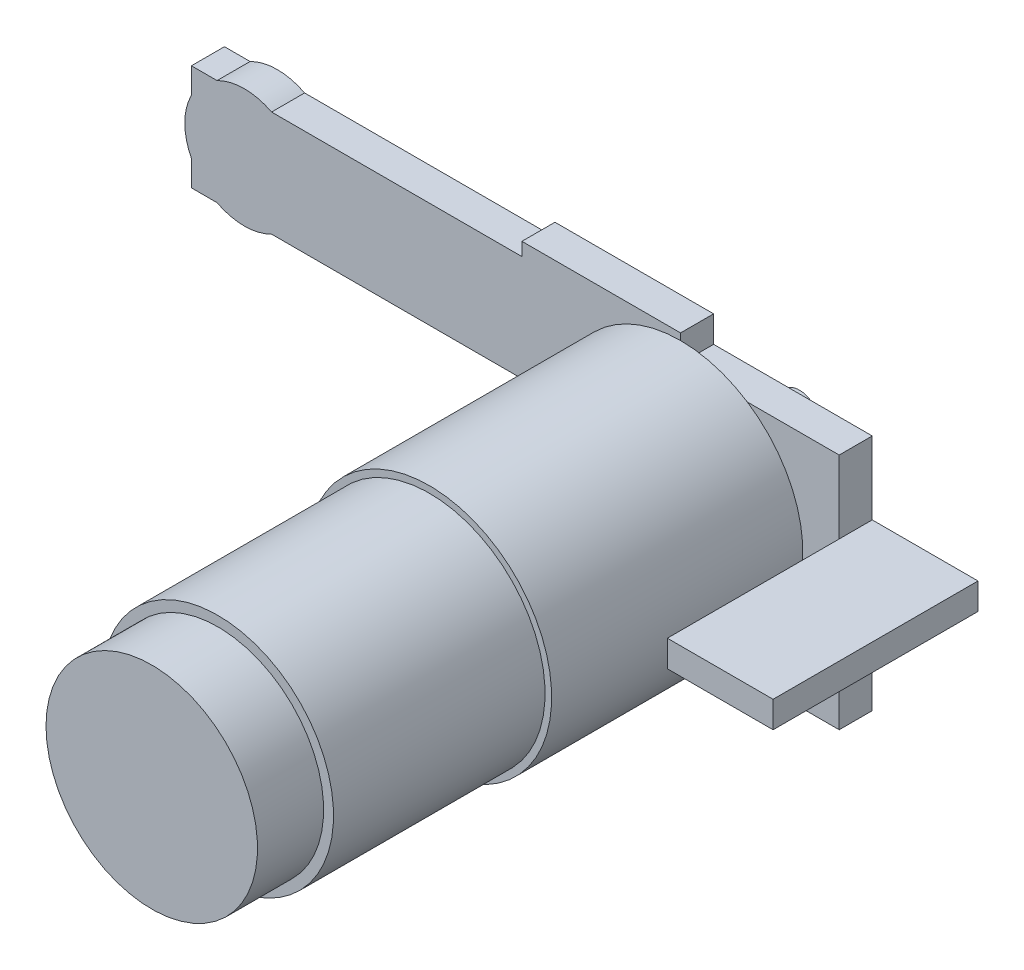
ISO-10303-21;
HEADER;
FILE_DESCRIPTION(('STEP AP214'),'2;1');
FILE_NAME('part.step','',(''),(''),'','','');
FILE_SCHEMA(('AUTOMOTIVE_DESIGN { 1 0 10303 214 1 1 1 1 }'));
ENDSEC;
DATA;
#1=APPLICATION_CONTEXT('core data for automotive mechanical design processes');
#2=APPLICATION_PROTOCOL_DEFINITION('international standard','automotive_design',2000,#1);
#3=PRODUCT_CONTEXT('',#1,'mechanical');
#4=PRODUCT('Part','Part','',(#3));
#5=PRODUCT_RELATED_PRODUCT_CATEGORY('part','',(#4));
#6=PRODUCT_DEFINITION_FORMATION('','',#4);
#7=PRODUCT_DEFINITION_CONTEXT('part definition',#1,'design');
#8=PRODUCT_DEFINITION('design','',#6,#7);
#9=PRODUCT_DEFINITION_SHAPE('','',#8);
#10=(LENGTH_UNIT() NAMED_UNIT(*) SI_UNIT(.MILLI.,.METRE.));
#11=(NAMED_UNIT(*) PLANE_ANGLE_UNIT() SI_UNIT($,.RADIAN.));
#12=(NAMED_UNIT(*) SI_UNIT($,.STERADIAN.) SOLID_ANGLE_UNIT());
#13=UNCERTAINTY_MEASURE_WITH_UNIT(LENGTH_MEASURE(1.E-05),#10,'distance_accuracy_value','');
#14=(GEOMETRIC_REPRESENTATION_CONTEXT(3) GLOBAL_UNCERTAINTY_ASSIGNED_CONTEXT((#13)) GLOBAL_UNIT_ASSIGNED_CONTEXT((#10,
#11,#12)) REPRESENTATION_CONTEXT('',''));
#15=CARTESIAN_POINT('',(0.,0.,0.));
#16=DIRECTION('',(0.,0.,1.));
#17=DIRECTION('',(1.,0.,0.));
#18=AXIS2_PLACEMENT_3D('',#15,#16,#17);
#19=CARTESIAN_POINT('',(41.5,36.,-31.));
#20=DIRECTION('',(-1.,0.,0.));
#21=DIRECTION('',(0.,0.,1.));
#22=AXIS2_PLACEMENT_3D('',#19,#20,#21);
#23=PLANE('',#22);
#24=DIRECTION('',(0.,0.,1.));
#25=VECTOR('',#24,1.);
#26=CARTESIAN_POINT('',(41.5,25.,-36.));
#27=LINE('',#26,#25);
#28=CARTESIAN_POINT('',(41.5,25.,-36.));
#29=VERTEX_POINT('',#28);
#30=CARTESIAN_POINT('',(41.5,25.,-31.));
#31=VERTEX_POINT('',#30);
#32=EDGE_CURVE('E197',#29,#31,#27,.T.);
#33=ORIENTED_EDGE('',*,*,#32,.F.);
#34=DIRECTION('',(0.,-1.,0.));
#35=VECTOR('',#34,1.);
#36=CARTESIAN_POINT('',(41.5,36.,-36.));
#37=LINE('',#36,#35);
#38=CARTESIAN_POINT('',(41.5,36.,-36.));
#39=VERTEX_POINT('',#38);
#40=EDGE_CURVE('E292',#39,#29,#37,.T.);
#41=ORIENTED_EDGE('',*,*,#40,.F.);
#42=DIRECTION('',(0.,0.,-1.));
#43=VECTOR('',#42,1.);
#44=CARTESIAN_POINT('',(41.5,36.,-31.));
#45=LINE('',#44,#43);
#46=CARTESIAN_POINT('',(41.5,36.,-31.));
#47=VERTEX_POINT('',#46);
#48=EDGE_CURVE('E284',#47,#39,#45,.T.);
#49=ORIENTED_EDGE('',*,*,#48,.F.);
#50=DIRECTION('',(0.,-1.,0.));
#51=VECTOR('',#50,1.);
#52=CARTESIAN_POINT('',(41.5,36.,-31.));
#53=LINE('',#52,#51);
#54=EDGE_CURVE('E293',#47,#31,#53,.T.);
#55=ORIENTED_EDGE('',*,*,#54,.T.);
#56=EDGE_LOOP('',(#33,#41,#49,#55));
#57=FACE_BOUND('',#56,.T.);
#58=ADVANCED_FACE('F43',(#57),#23,.F.);
#59=CARTESIAN_POINT('',(-56.5,38.,-36.));
#60=DIRECTION('',(1.,0.,0.));
#61=DIRECTION('',(0.,0.,-1.));
#62=AXIS2_PLACEMENT_3D('',#59,#60,#61);
#63=PLANE('',#62);
#64=DIRECTION('',(0.,0.,-1.));
#65=VECTOR('',#64,1.);
#66=CARTESIAN_POINT('',(-56.5,25.8768943743823,-31.));
#67=LINE('',#66,#65);
#68=CARTESIAN_POINT('',(-56.5,25.8768943743823,-36.));
#69=VERTEX_POINT('',#68);
#70=CARTESIAN_POINT('',(-56.5,25.8768943743823,-31.));
#71=VERTEX_POINT('',#70);
#72=EDGE_CURVE('E238',#69,#71,#67,.F.);
#73=ORIENTED_EDGE('',*,*,#72,.F.);
#74=DIRECTION('',(0.,-1.,0.));
#75=VECTOR('',#74,1.);
#76=CARTESIAN_POINT('',(-56.5,38.,-36.));
#77=LINE('',#76,#75);
#78=CARTESIAN_POINT('',(-56.5,22.,-36.));
#79=VERTEX_POINT('',#78);
#80=EDGE_CURVE('E259',#69,#79,#77,.T.);
#81=ORIENTED_EDGE('',*,*,#80,.T.);
#82=DIRECTION('',(0.,0.,1.));
#83=VECTOR('',#82,1.);
#84=CARTESIAN_POINT('',(-56.5,22.,-36.));
#85=LINE('',#84,#83);
#86=CARTESIAN_POINT('',(-56.5,22.,-31.));
#87=VERTEX_POINT('',#86);
#88=EDGE_CURVE('E242',#79,#87,#85,.T.);
#89=ORIENTED_EDGE('',*,*,#88,.T.);
#90=DIRECTION('',(0.,-1.,0.));
#91=VECTOR('',#90,1.);
#92=CARTESIAN_POINT('',(-56.5,38.,-31.));
#93=LINE('',#92,#91);
#94=EDGE_CURVE('E272',#71,#87,#93,.T.);
#95=ORIENTED_EDGE('',*,*,#94,.F.);
#96=EDGE_LOOP('',(#73,#81,#89,#95));
#97=FACE_BOUND('',#96,.T.);
#98=ADVANCED_FACE('F384',(#97),#63,.F.);
#99=DIRECTION('',(0.,0.,-1.));
#100=VECTOR('',#99,1.);
#101=CARTESIAN_POINT('',(-56.5,34.1231056256177,-31.));
#102=LINE('',#101,#100);
#103=CARTESIAN_POINT('',(-56.5,34.1231056256177,-31.));
#104=VERTEX_POINT('',#103);
#105=CARTESIAN_POINT('',(-56.5,34.1231056256177,-36.));
#106=VERTEX_POINT('',#105);
#107=EDGE_CURVE('E240',#104,#106,#102,.T.);
#108=ORIENTED_EDGE('',*,*,#107,.F.);
#109=CARTESIAN_POINT('',(-56.5,38.,-31.));
#110=VERTEX_POINT('',#109);
#111=EDGE_CURVE('E273',#110,#104,#93,.T.);
#112=ORIENTED_EDGE('',*,*,#111,.F.);
#113=DIRECTION('',(0.,0.,1.));
#114=VECTOR('',#113,1.);
#115=CARTESIAN_POINT('',(-56.5,38.,-36.));
#116=LINE('',#115,#114);
#117=CARTESIAN_POINT('',(-56.5,38.,-36.));
#118=VERTEX_POINT('',#117);
#119=EDGE_CURVE('E243',#118,#110,#116,.T.);
#120=ORIENTED_EDGE('',*,*,#119,.F.);
#121=EDGE_CURVE('E271',#118,#106,#77,.T.);
#122=ORIENTED_EDGE('',*,*,#121,.T.);
#123=EDGE_LOOP('',(#108,#112,#120,#122));
#124=FACE_BOUND('',#123,.T.);
#125=ADVANCED_FACE('F391',(#124),#63,.F.);
#126=CARTESIAN_POINT('',(0.,38.,0.));
#127=DIRECTION('',(0.,1.,0.));
#128=DIRECTION('',(0.,0.,1.));
#129=AXIS2_PLACEMENT_3D('',#126,#127,#128);
#130=PLANE('',#129);
#131=DIRECTION('',(-1.,0.,0.));
#132=VECTOR('',#131,1.);
#133=CARTESIAN_POINT('',(-6.5,38.,-36.));
#134=LINE('',#133,#132);
#135=CARTESIAN_POINT('',(-6.5,38.,-36.));
#136=VERTEX_POINT('',#135);
#137=CARTESIAN_POINT('',(-44.3768943743823,38.,-36.));
#138=VERTEX_POINT('',#137);
#139=EDGE_CURVE('E258',#136,#138,#134,.T.);
#140=ORIENTED_EDGE('',*,*,#139,.T.);
#141=DIRECTION('',(0.,0.,-1.));
#142=VECTOR('',#141,1.);
#143=CARTESIAN_POINT('',(-44.3768943743823,38.,-31.));
#144=LINE('',#143,#142);
#145=CARTESIAN_POINT('',(-44.3768943743823,38.,-31.));
#146=VERTEX_POINT('',#145);
#147=EDGE_CURVE('E231',#138,#146,#144,.F.);
#148=ORIENTED_EDGE('',*,*,#147,.T.);
#149=DIRECTION('',(1.,0.,0.));
#150=VECTOR('',#149,1.);
#151=CARTESIAN_POINT('',(-56.5,38.,-31.));
#152=LINE('',#151,#150);
#153=CARTESIAN_POINT('',(-6.5,38.,-31.));
#154=VERTEX_POINT('',#153);
#155=EDGE_CURVE('E249',#146,#154,#152,.T.);
#156=ORIENTED_EDGE('',*,*,#155,.T.);
#157=DIRECTION('',(0.,0.,-1.));
#158=VECTOR('',#157,1.);
#159=CARTESIAN_POINT('',(-6.5,38.,-31.));
#160=LINE('',#159,#158);
#161=EDGE_CURVE('E252',#154,#136,#160,.T.);
#162=ORIENTED_EDGE('',*,*,#161,.T.);
#163=EDGE_LOOP('',(#140,#148,#156,#162));
#164=FACE_BOUND('',#163,.T.);
#165=ADVANCED_FACE('F396',(#164),#130,.T.);
#166=CARTESIAN_POINT('',(-52.6231056256177,38.,-31.));
#167=VERTEX_POINT('',#166);
#168=EDGE_CURVE('E246',#110,#167,#152,.T.);
#169=ORIENTED_EDGE('',*,*,#168,.T.);
#170=DIRECTION('',(0.,0.,-1.));
#171=VECTOR('',#170,1.);
#172=CARTESIAN_POINT('',(-52.6231056256177,38.,-31.));
#173=LINE('',#172,#171);
#174=CARTESIAN_POINT('',(-52.6231056256177,38.,-36.));
#175=VERTEX_POINT('',#174);
#176=EDGE_CURVE('E227',#167,#175,#173,.T.);
#177=ORIENTED_EDGE('',*,*,#176,.T.);
#178=EDGE_CURVE('E254',#175,#118,#134,.T.);
#179=ORIENTED_EDGE('',*,*,#178,.T.);
#180=ORIENTED_EDGE('',*,*,#119,.T.);
#181=EDGE_LOOP('',(#169,#177,#179,#180));
#182=FACE_BOUND('',#181,.T.);
#183=ADVANCED_FACE('F392',(#182),#130,.T.);
#184=CARTESIAN_POINT('',(0.,22.,0.));
#185=DIRECTION('',(0.,1.,0.));
#186=DIRECTION('',(0.,0.,1.));
#187=AXIS2_PLACEMENT_3D('',#184,#185,#186);
#188=PLANE('',#187);
#189=DIRECTION('',(0.,0.,-1.));
#190=VECTOR('',#189,1.);
#191=CARTESIAN_POINT('',(-44.3768943743823,22.,-31.));
#192=LINE('',#191,#190);
#193=CARTESIAN_POINT('',(-44.3768943743823,22.,-36.));
#194=VERTEX_POINT('',#193);
#195=CARTESIAN_POINT('',(-44.3768943743823,22.,-31.));
#196=VERTEX_POINT('',#195);
#197=EDGE_CURVE('E11',#194,#196,#192,.F.);
#198=ORIENTED_EDGE('',*,*,#197,.F.);
#199=DIRECTION('',(-1.,0.,0.));
#200=VECTOR('',#199,1.);
#201=CARTESIAN_POINT('',(-6.5,22.,-36.));
#202=LINE('',#201,#200);
#203=CARTESIAN_POINT('',(-6.5,22.,-36.));
#204=VERTEX_POINT('',#203);
#205=EDGE_CURVE('E250',#204,#194,#202,.T.);
#206=ORIENTED_EDGE('',*,*,#205,.F.);
#207=DIRECTION('',(0.,0.,-1.));
#208=VECTOR('',#207,1.);
#209=CARTESIAN_POINT('',(-6.5,22.,-31.));
#210=LINE('',#209,#208);
#211=CARTESIAN_POINT('',(-6.5,22.,-31.));
#212=VERTEX_POINT('',#211);
#213=EDGE_CURVE('E266',#212,#204,#210,.T.);
#214=ORIENTED_EDGE('',*,*,#213,.F.);
#215=DIRECTION('',(1.,0.,0.));
#216=VECTOR('',#215,1.);
#217=CARTESIAN_POINT('',(-56.5,22.,-31.));
#218=LINE('',#217,#216);
#219=EDGE_CURVE('E265',#196,#212,#218,.T.);
#220=ORIENTED_EDGE('',*,*,#219,.F.);
#221=EDGE_LOOP('',(#198,#206,#214,#220));
#222=FACE_BOUND('',#221,.T.);
#223=ADVANCED_FACE('F375',(#222),#188,.F.);
#224=DIRECTION('',(0.,0.,-1.));
#225=VECTOR('',#224,1.);
#226=CARTESIAN_POINT('',(-52.6231056256177,22.,-31.));
#227=LINE('',#226,#225);
#228=CARTESIAN_POINT('',(-52.6231056256177,22.,-31.));
#229=VERTEX_POINT('',#228);
#230=CARTESIAN_POINT('',(-52.6231056256177,22.,-36.));
#231=VERTEX_POINT('',#230);
#232=EDGE_CURVE('E51',#229,#231,#227,.T.);
#233=ORIENTED_EDGE('',*,*,#232,.F.);
#234=EDGE_CURVE('E263',#87,#229,#218,.T.);
#235=ORIENTED_EDGE('',*,*,#234,.F.);
#236=ORIENTED_EDGE('',*,*,#88,.F.);
#237=EDGE_CURVE('E268',#231,#79,#202,.T.);
#238=ORIENTED_EDGE('',*,*,#237,.F.);
#239=EDGE_LOOP('',(#233,#235,#236,#238));
#240=FACE_BOUND('',#239,.T.);
#241=ADVANCED_FACE('F723',(#240),#188,.F.);
#242=CARTESIAN_POINT('',(-6.5,40.,-36.));
#243=DIRECTION('',(1.,0.,0.));
#244=DIRECTION('',(0.,0.,-1.));
#245=AXIS2_PLACEMENT_3D('',#242,#243,#244);
#246=PLANE('',#245);
#247=ORIENTED_EDGE('',*,*,#161,.F.);
#248=DIRECTION('',(0.,-1.,0.));
#249=VECTOR('',#248,1.);
#250=CARTESIAN_POINT('',(-6.5,40.,-31.));
#251=LINE('',#250,#249);
#252=CARTESIAN_POINT('',(-6.5,40.,-31.));
#253=VERTEX_POINT('',#252);
#254=EDGE_CURVE('E330',#253,#154,#251,.T.);
#255=ORIENTED_EDGE('',*,*,#254,.F.);
#256=DIRECTION('',(0.,0.,1.));
#257=VECTOR('',#256,1.);
#258=CARTESIAN_POINT('',(-6.5,40.,-36.));
#259=LINE('',#258,#257);
#260=CARTESIAN_POINT('',(-6.5,40.,-36.));
#261=VERTEX_POINT('',#260);
#262=EDGE_CURVE('E298',#261,#253,#259,.T.);
#263=ORIENTED_EDGE('',*,*,#262,.F.);
#264=DIRECTION('',(0.,-1.,0.));
#265=VECTOR('',#264,1.);
#266=CARTESIAN_POINT('',(-6.5,40.,-36.));
#267=LINE('',#266,#265);
#268=EDGE_CURVE('E320',#261,#136,#267,.T.);
#269=ORIENTED_EDGE('',*,*,#268,.T.);
#270=EDGE_LOOP('',(#247,#255,#263,#269));
#271=FACE_BOUND('',#270,.T.);
#272=ADVANCED_FACE('F405',(#271),#246,.F.);
#273=CARTESIAN_POINT('',(17.5,40.,-31.));
#274=DIRECTION('',(-1.,0.,0.));
#275=DIRECTION('',(0.,0.,1.));
#276=AXIS2_PLACEMENT_3D('',#273,#274,#275);
#277=PLANE('',#276);
#278=DIRECTION('',(0.,0.,1.));
#279=VECTOR('',#278,1.);
#280=CARTESIAN_POINT('',(17.5,36.,-36.));
#281=LINE('',#280,#279);
#282=CARTESIAN_POINT('',(17.5,36.,-36.));
#283=VERTEX_POINT('',#282);
#284=CARTESIAN_POINT('',(17.5,36.,-31.));
#285=VERTEX_POINT('',#284);
#286=EDGE_CURVE('E279',#283,#285,#281,.T.);
#287=ORIENTED_EDGE('',*,*,#286,.F.);
#288=DIRECTION('',(0.,-1.,0.));
#289=VECTOR('',#288,1.);
#290=CARTESIAN_POINT('',(17.5,40.,-36.));
#291=LINE('',#290,#289);
#292=CARTESIAN_POINT('',(17.5,40.,-36.));
#293=VERTEX_POINT('',#292);
#294=EDGE_CURVE('E317',#293,#283,#291,.T.);
#295=ORIENTED_EDGE('',*,*,#294,.F.);
#296=DIRECTION('',(0.,0.,-1.));
#297=VECTOR('',#296,1.);
#298=CARTESIAN_POINT('',(17.5,40.,-31.));
#299=LINE('',#298,#297);
#300=CARTESIAN_POINT('',(17.5,40.,-31.));
#301=VERTEX_POINT('',#300);
#302=EDGE_CURVE('E303',#301,#293,#299,.T.);
#303=ORIENTED_EDGE('',*,*,#302,.F.);
#304=DIRECTION('',(0.,-1.,0.));
#305=VECTOR('',#304,1.);
#306=CARTESIAN_POINT('',(17.5,40.,-31.));
#307=LINE('',#306,#305);
#308=CARTESIAN_POINT('',(17.5,39.,-31.));
#309=VERTEX_POINT('',#308);
#310=EDGE_CURVE('E323',#301,#309,#307,.T.);
#311=ORIENTED_EDGE('',*,*,#310,.T.);
#312=EDGE_CURVE('E325',#309,#285,#307,.T.);
#313=ORIENTED_EDGE('',*,*,#312,.T.);
#314=EDGE_LOOP('',(#287,#295,#303,#311,#313));
#315=FACE_BOUND('',#314,.T.);
#316=ADVANCED_FACE('F415',(#315),#277,.F.);
#317=CARTESIAN_POINT('',(17.5,20.5,-54.));
#318=DIRECTION('',(0.,0.,-1.));
#319=DIRECTION('',(-1.,0.,0.));
#320=AXIS2_PLACEMENT_3D('',#317,#318,#319);
#321=CYLINDRICAL_SURFACE('',#320,3.);
#322=CARTESIAN_POINT('',(17.5,20.5,-49.));
#323=DIRECTION('',(0.,0.,-1.));
#324=DIRECTION('',(-1.,0.,0.));
#325=AXIS2_PLACEMENT_3D('',#322,#323,#324);
#326=CIRCLE('',#325,3.);
#327=CARTESIAN_POINT('',(14.5,20.5,-49.));
#328=VERTEX_POINT('',#327);
#329=EDGE_CURVE('E349',#328,#328,#326,.T.);
#330=ORIENTED_EDGE('',*,*,#329,.F.);
#331=EDGE_LOOP('',(#330));
#332=FACE_BOUND('',#331,.T.);
#333=CARTESIAN_POINT('',(17.5,20.5,-36.));
#334=DIRECTION('',(0.,0.,1.));
#335=DIRECTION('',(1.,0.,0.));
#336=AXIS2_PLACEMENT_3D('',#333,#334,#335);
#337=CIRCLE('',#336,3.);
#338=CARTESIAN_POINT('',(20.5,20.5,-36.));
#339=VERTEX_POINT('',#338);
#340=EDGE_CURVE('E355',#339,#339,#337,.T.);
#341=ORIENTED_EDGE('',*,*,#340,.F.);
#342=EDGE_LOOP('',(#341));
#343=FACE_BOUND('',#342,.T.);
#344=ADVANCED_FACE('F475',(#332,#343),#321,.T.);
#345=CARTESIAN_POINT('',(20.5,20.5,-31.));
#346=DIRECTION('',(0.,0.,1.));
#347=DIRECTION('',(1.,0.,0.));
#348=AXIS2_PLACEMENT_3D('',#345,#346,#347);
#349=PLANE('',#348);
#350=DIRECTION('',(1.,0.,0.));
#351=VECTOR('',#350,1.);
#352=CARTESIAN_POINT('',(17.5,36.,-31.));
#353=LINE('',#352,#351);
#354=CARTESIAN_POINT('',(27.5995049383621,36.,-31.));
#355=VERTEX_POINT('',#354);
#356=EDGE_CURVE('E285',#285,#355,#353,.T.);
#357=ORIENTED_EDGE('',*,*,#356,.F.);
#358=ORIENTED_EDGE('',*,*,#312,.F.);
#359=CARTESIAN_POINT('',(17.5,20.5,-31.));
#360=DIRECTION('',(0.,0.,-1.));
#361=DIRECTION('',(-1.,0.,0.));
#362=AXIS2_PLACEMENT_3D('',#359,#360,#361);
#363=CIRCLE('',#362,18.5);
#364=EDGE_CURVE('E347',#309,#355,#363,.T.);
#365=ORIENTED_EDGE('',*,*,#364,.T.);
#366=EDGE_LOOP('',(#357,#358,#365));
#367=FACE_BOUND('',#366,.T.);
#368=ADVANCED_FACE('F504',(#367),#349,.F.);
#369=CARTESIAN_POINT('',(17.5,20.5,-49.));
#370=DIRECTION('',(0.,0.,1.));
#371=DIRECTION('',(1.,0.,0.));
#372=AXIS2_PLACEMENT_3D('',#369,#370,#371);
#373=PLANE('',#372);
#374=ORIENTED_EDGE('',*,*,#329,.T.);
#375=EDGE_LOOP('',(#374));
#376=FACE_BOUND('',#375,.T.);
#377=ADVANCED_FACE('F44',(#376),#373,.F.);
#378=CARTESIAN_POINT('',(17.5,20.5,-54.));
#379=DIRECTION('',(0.,0.,-1.));
#380=DIRECTION('',(-1.,0.,0.));
#381=AXIS2_PLACEMENT_3D('',#378,#379,#380);
#382=CYLINDRICAL_SURFACE('',#381,18.5);
#383=ORIENTED_EDGE('',*,*,#364,.F.);
#384=EDGE_CURVE('E343',#355,#309,#363,.T.);
#385=ORIENTED_EDGE('',*,*,#384,.F.);
#386=EDGE_LOOP('',(#383,#385));
#387=FACE_BOUND('',#386,.T.);
#388=CARTESIAN_POINT('',(17.5,20.5,7.));
#389=DIRECTION('',(0.,0.,-1.));
#390=DIRECTION('',(-1.,0.,0.));
#391=AXIS2_PLACEMENT_3D('',#388,#389,#390);
#392=CIRCLE('',#391,18.5);
#393=CARTESIAN_POINT('',(-0.999999999999994,20.5,7.));
#394=VERTEX_POINT('',#393);
#395=EDGE_CURVE('E344',#394,#394,#392,.T.);
#396=ORIENTED_EDGE('',*,*,#395,.T.);
#397=EDGE_LOOP('',(#396));
#398=FACE_BOUND('',#397,.T.);
#399=ADVANCED_FACE('F498',(#387,#398),#382,.T.);
#400=CARTESIAN_POINT('',(36.,20.5,7.));
#401=DIRECTION('',(0.,0.,-1.));
#402=DIRECTION('',(-1.,0.,0.));
#403=AXIS2_PLACEMENT_3D('',#400,#401,#402);
#404=PLANE('',#403);
#405=ORIENTED_EDGE('',*,*,#395,.F.);
#406=EDGE_LOOP('',(#405));
#407=FACE_BOUND('',#406,.T.);
#408=CARTESIAN_POINT('',(17.5,20.5,7.));
#409=DIRECTION('',(0.,0.,-1.));
#410=DIRECTION('',(-1.,0.,0.));
#411=AXIS2_PLACEMENT_3D('',#408,#409,#410);
#412=CIRCLE('',#411,17.5);
#413=CARTESIAN_POINT('',(0.,20.5,7.));
#414=VERTEX_POINT('',#413);
#415=EDGE_CURVE('E338',#414,#414,#412,.T.);
#416=ORIENTED_EDGE('',*,*,#415,.T.);
#417=EDGE_LOOP('',(#416));
#418=FACE_BOUND('',#417,.T.);
#419=ADVANCED_FACE('F497',(#407,#418),#404,.F.);
#420=CARTESIAN_POINT('',(17.5,20.5,-54.));
#421=DIRECTION('',(0.,0.,-1.));
#422=DIRECTION('',(-1.,0.,0.));
#423=AXIS2_PLACEMENT_3D('',#420,#421,#422);
#424=CYLINDRICAL_SURFACE('',#423,17.5);
#425=ORIENTED_EDGE('',*,*,#415,.F.);
#426=EDGE_LOOP('',(#425));
#427=FACE_BOUND('',#426,.T.);
#428=CARTESIAN_POINT('',(17.5,20.5,39.));
#429=DIRECTION('',(0.,0.,-1.));
#430=DIRECTION('',(-1.,0.,0.));
#431=AXIS2_PLACEMENT_3D('',#428,#429,#430);
#432=CIRCLE('',#431,17.5);
#433=CARTESIAN_POINT('',(0.,20.5,39.));
#434=VERTEX_POINT('',#433);
#435=EDGE_CURVE('E336',#434,#434,#432,.T.);
#436=ORIENTED_EDGE('',*,*,#435,.T.);
#437=EDGE_LOOP('',(#436));
#438=FACE_BOUND('',#437,.T.);
#439=ADVANCED_FACE('F495',(#427,#438),#424,.T.);
#440=CARTESIAN_POINT('',(35.,20.5,39.));
#441=DIRECTION('',(0.,0.,-1.));
#442=DIRECTION('',(-1.,0.,0.));
#443=AXIS2_PLACEMENT_3D('',#440,#441,#442);
#444=PLANE('',#443);
#445=ORIENTED_EDGE('',*,*,#435,.F.);
#446=EDGE_LOOP('',(#445));
#447=FACE_BOUND('',#446,.T.);
#448=CARTESIAN_POINT('',(17.5,20.5,39.));
#449=DIRECTION('',(0.,0.,-1.));
#450=DIRECTION('',(-1.,0.,0.));
#451=AXIS2_PLACEMENT_3D('',#448,#449,#450);
#452=CIRCLE('',#451,16.);
#453=CARTESIAN_POINT('',(1.5,20.5,39.));
#454=VERTEX_POINT('',#453);
#455=EDGE_CURVE('E334',#454,#454,#452,.T.);
#456=ORIENTED_EDGE('',*,*,#455,.T.);
#457=EDGE_LOOP('',(#456));
#458=FACE_BOUND('',#457,.T.);
#459=ADVANCED_FACE('F488',(#447,#458),#444,.F.);
#460=CARTESIAN_POINT('',(17.5,20.5,-54.));
#461=DIRECTION('',(0.,0.,-1.));
#462=DIRECTION('',(-1.,0.,0.));
#463=AXIS2_PLACEMENT_3D('',#460,#461,#462);
#464=CYLINDRICAL_SURFACE('',#463,16.);
#465=ORIENTED_EDGE('',*,*,#455,.F.);
#466=EDGE_LOOP('',(#465));
#467=FACE_BOUND('',#466,.T.);
#468=CARTESIAN_POINT('',(17.5,20.5,49.));
#469=DIRECTION('',(0.,0.,-1.));
#470=DIRECTION('',(-1.,0.,0.));
#471=AXIS2_PLACEMENT_3D('',#468,#469,#470);
#472=CIRCLE('',#471,16.);
#473=CARTESIAN_POINT('',(1.5,20.5,49.));
#474=VERTEX_POINT('',#473);
#475=EDGE_CURVE('E329',#474,#474,#472,.T.);
#476=ORIENTED_EDGE('',*,*,#475,.T.);
#477=EDGE_LOOP('',(#476));
#478=FACE_BOUND('',#477,.T.);
#479=ADVANCED_FACE('F482',(#467,#478),#464,.T.);
#480=CARTESIAN_POINT('',(33.5,20.5,49.));
#481=DIRECTION('',(0.,0.,-1.));
#482=DIRECTION('',(-1.,0.,0.));
#483=AXIS2_PLACEMENT_3D('',#480,#481,#482);
#484=PLANE('',#483);
#485=ORIENTED_EDGE('',*,*,#475,.F.);
#486=EDGE_LOOP('',(#485));
#487=FACE_BOUND('',#486,.T.);
#488=ADVANCED_FACE('F477',(#487),#484,.F.);
#489=CARTESIAN_POINT('',(-6.5,0.,-31.));
#490=VERTEX_POINT('',#489);
#491=EDGE_CURVE('E326',#212,#490,#251,.T.);
#492=ORIENTED_EDGE('',*,*,#491,.F.);
#493=ORIENTED_EDGE('',*,*,#213,.T.);
#494=CARTESIAN_POINT('',(-6.5,0.,-36.));
#495=VERTEX_POINT('',#494);
#496=EDGE_CURVE('E310',#204,#495,#267,.T.);
#497=ORIENTED_EDGE('',*,*,#496,.T.);
#498=DIRECTION('',(0.,0.,1.));
#499=VECTOR('',#498,1.);
#500=CARTESIAN_POINT('',(-6.5,0.,-36.));
#501=LINE('',#500,#499);
#502=EDGE_CURVE('E300',#495,#490,#501,.T.);
#503=ORIENTED_EDGE('',*,*,#502,.T.);
#504=EDGE_LOOP('',(#492,#493,#497,#503));
#505=FACE_BOUND('',#504,.T.);
#506=ADVANCED_FACE('F480',(#505),#246,.F.);
#507=CARTESIAN_POINT('',(-6.5,40.,-31.));
#508=DIRECTION('',(0.,0.,-1.));
#509=DIRECTION('',(-1.,0.,0.));
#510=AXIS2_PLACEMENT_3D('',#507,#508,#509);
#511=PLANE('',#510);
#512=ORIENTED_EDGE('',*,*,#155,.F.);
#513=CARTESIAN_POINT('',(-48.5,30.,-31.));
#514=DIRECTION('',(0.,0.,1.));
#515=DIRECTION('',(1.,0.,0.));
#516=AXIS2_PLACEMENT_3D('',#513,#514,#515);
#517=CIRCLE('',#516,9.);
#518=EDGE_CURVE('E226',#146,#167,#517,.T.);
#519=ORIENTED_EDGE('',*,*,#518,.T.);
#520=ORIENTED_EDGE('',*,*,#168,.F.);
#521=ORIENTED_EDGE('',*,*,#111,.T.);
#522=EDGE_CURVE('E228',#104,#71,#517,.T.);
#523=ORIENTED_EDGE('',*,*,#522,.T.);
#524=ORIENTED_EDGE('',*,*,#94,.T.);
#525=ORIENTED_EDGE('',*,*,#234,.T.);
#526=EDGE_CURVE('E229',#229,#196,#517,.T.);
#527=ORIENTED_EDGE('',*,*,#526,.T.);
#528=ORIENTED_EDGE('',*,*,#219,.T.);
#529=ORIENTED_EDGE('',*,*,#491,.T.);
#530=DIRECTION('',(1.,0.,0.));
#531=VECTOR('',#530,1.);
#532=CARTESIAN_POINT('',(-6.5,0.,-31.));
#533=LINE('',#532,#531);
#534=CARTESIAN_POINT('',(41.5,0.,-31.));
#535=VERTEX_POINT('',#534);
#536=EDGE_CURVE('E315',#490,#535,#533,.T.);
#537=ORIENTED_EDGE('',*,*,#536,.T.);
#538=CARTESIAN_POINT('',(41.5,21.,-31.));
#539=VERTEX_POINT('',#538);
#540=EDGE_CURVE('E294',#539,#535,#53,.T.);
#541=ORIENTED_EDGE('',*,*,#540,.F.);
#542=EDGE_CURVE('E297',#31,#539,#53,.T.);
#543=ORIENTED_EDGE('',*,*,#542,.F.);
#544=ORIENTED_EDGE('',*,*,#54,.F.);
#545=EDGE_CURVE('E281',#355,#47,#353,.T.);
#546=ORIENTED_EDGE('',*,*,#545,.F.);
#547=ORIENTED_EDGE('',*,*,#384,.T.);
#548=ORIENTED_EDGE('',*,*,#310,.F.);
#549=DIRECTION('',(1.,0.,0.));
#550=VECTOR('',#549,1.);
#551=CARTESIAN_POINT('',(-6.5,40.,-31.));
#552=LINE('',#551,#550);
#553=EDGE_CURVE('E304',#253,#301,#552,.T.);
#554=ORIENTED_EDGE('',*,*,#553,.F.);
#555=ORIENTED_EDGE('',*,*,#254,.T.);
#556=EDGE_LOOP('',(#512,#519,#520,#521,#523,#524,#525,#527,#528,#529,#537,#541,#543,#544,#546,
#547,#548,#554,#555));
#557=FACE_BOUND('',#556,.T.);
#558=ADVANCED_FACE('F374',(#557),#511,.F.);
#559=CARTESIAN_POINT('',(17.5,40.,-36.));
#560=DIRECTION('',(0.,0.,1.));
#561=DIRECTION('',(1.,0.,0.));
#562=AXIS2_PLACEMENT_3D('',#559,#560,#561);
#563=PLANE('',#562);
#564=ORIENTED_EDGE('',*,*,#80,.F.);
#565=CARTESIAN_POINT('',(-48.5,30.,-36.));
#566=DIRECTION('',(0.,0.,1.));
#567=DIRECTION('',(1.,0.,0.));
#568=AXIS2_PLACEMENT_3D('',#565,#566,#567);
#569=CIRCLE('',#568,9.);
#570=EDGE_CURVE('E218',#106,#69,#569,.T.);
#571=ORIENTED_EDGE('',*,*,#570,.F.);
#572=ORIENTED_EDGE('',*,*,#121,.F.);
#573=ORIENTED_EDGE('',*,*,#178,.F.);
#574=EDGE_CURVE('E222',#138,#175,#569,.T.);
#575=ORIENTED_EDGE('',*,*,#574,.F.);
#576=ORIENTED_EDGE('',*,*,#139,.F.);
#577=ORIENTED_EDGE('',*,*,#268,.F.);
#578=DIRECTION('',(-1.,0.,0.));
#579=VECTOR('',#578,1.);
#580=CARTESIAN_POINT('',(17.5,40.,-36.));
#581=LINE('',#580,#579);
#582=EDGE_CURVE('E307',#293,#261,#581,.T.);
#583=ORIENTED_EDGE('',*,*,#582,.F.);
#584=ORIENTED_EDGE('',*,*,#294,.T.);
#585=DIRECTION('',(-1.,0.,0.));
#586=VECTOR('',#585,1.);
#587=CARTESIAN_POINT('',(41.5,36.,-36.));
#588=LINE('',#587,#586);
#589=EDGE_CURVE('E289',#39,#283,#588,.T.);
#590=ORIENTED_EDGE('',*,*,#589,.F.);
#591=ORIENTED_EDGE('',*,*,#40,.T.);
#592=DIRECTION('',(-1.,0.,0.));
#593=VECTOR('',#592,1.);
#594=CARTESIAN_POINT('',(57.5,25.,-36.));
#595=LINE('',#594,#593);
#596=CARTESIAN_POINT('',(57.5,25.,-36.));
#597=VERTEX_POINT('',#596);
#598=EDGE_CURVE('E423',#597,#29,#595,.T.);
#599=ORIENTED_EDGE('',*,*,#598,.F.);
#600=DIRECTION('',(0.,-1.,0.));
#601=VECTOR('',#600,1.);
#602=CARTESIAN_POINT('',(57.5,25.,-36.));
#603=LINE('',#602,#601);
#604=CARTESIAN_POINT('',(57.5,21.,-36.));
#605=VERTEX_POINT('',#604);
#606=EDGE_CURVE('E225',#597,#605,#603,.T.);
#607=ORIENTED_EDGE('',*,*,#606,.T.);
#608=DIRECTION('',(-1.,0.,0.));
#609=VECTOR('',#608,1.);
#610=CARTESIAN_POINT('',(57.5,21.,-36.));
#611=LINE('',#610,#609);
#612=CARTESIAN_POINT('',(41.5,21.,-36.));
#613=VERTEX_POINT('',#612);
#614=EDGE_CURVE('E203',#605,#613,#611,.T.);
#615=ORIENTED_EDGE('',*,*,#614,.T.);
#616=CARTESIAN_POINT('',(41.5,0.,-36.));
#617=VERTEX_POINT('',#616);
#618=EDGE_CURVE('E62',#613,#617,#37,.T.);
#619=ORIENTED_EDGE('',*,*,#618,.T.);
#620=DIRECTION('',(-1.,0.,0.));
#621=VECTOR('',#620,1.);
#622=CARTESIAN_POINT('',(17.5,0.,-36.));
#623=LINE('',#622,#621);
#624=EDGE_CURVE('E305',#617,#495,#623,.T.);
#625=ORIENTED_EDGE('',*,*,#624,.T.);
#626=ORIENTED_EDGE('',*,*,#496,.F.);
#627=ORIENTED_EDGE('',*,*,#205,.T.);
#628=EDGE_CURVE('E216',#231,#194,#569,.T.);
#629=ORIENTED_EDGE('',*,*,#628,.F.);
#630=ORIENTED_EDGE('',*,*,#237,.T.);
#631=EDGE_LOOP('',(#564,#571,#572,#573,#575,#576,#577,#583,#584,#590,#591,#599,#607,#615,#619,
#625,#626,#627,#629,#630));
#632=FACE_BOUND('',#631,.T.);
#633=ORIENTED_EDGE('',*,*,#340,.T.);
#634=EDGE_LOOP('',(#633));
#635=FACE_BOUND('',#634,.T.);
#636=ADVANCED_FACE('F364',(#632,#635),#563,.F.);
#637=CARTESIAN_POINT('',(0.,40.,0.));
#638=DIRECTION('',(0.,1.,0.));
#639=DIRECTION('',(0.,0.,1.));
#640=AXIS2_PLACEMENT_3D('',#637,#638,#639);
#641=PLANE('',#640);
#642=ORIENTED_EDGE('',*,*,#262,.T.);
#643=ORIENTED_EDGE('',*,*,#553,.T.);
#644=ORIENTED_EDGE('',*,*,#302,.T.);
#645=ORIENTED_EDGE('',*,*,#582,.T.);
#646=EDGE_LOOP('',(#642,#643,#644,#645));
#647=FACE_BOUND('',#646,.T.);
#648=ADVANCED_FACE('F408',(#647),#641,.T.);
#649=CARTESIAN_POINT('',(0.,0.,0.));
#650=DIRECTION('',(0.,1.,0.));
#651=DIRECTION('',(0.,0.,1.));
#652=AXIS2_PLACEMENT_3D('',#649,#650,#651);
#653=PLANE('',#652);
#654=ORIENTED_EDGE('',*,*,#502,.F.);
#655=ORIENTED_EDGE('',*,*,#624,.F.);
#656=DIRECTION('',(0.,0.,-1.));
#657=VECTOR('',#656,1.);
#658=CARTESIAN_POINT('',(41.5,0.,-31.));
#659=LINE('',#658,#657);
#660=EDGE_CURVE('E280',#535,#617,#659,.T.);
#661=ORIENTED_EDGE('',*,*,#660,.F.);
#662=ORIENTED_EDGE('',*,*,#536,.F.);
#663=EDGE_LOOP('',(#654,#655,#661,#662));
#664=FACE_BOUND('',#663,.T.);
#665=ADVANCED_FACE('F456',(#664),#653,.F.);
#666=ORIENTED_EDGE('',*,*,#618,.F.);
#667=DIRECTION('',(0.,0.,1.));
#668=VECTOR('',#667,1.);
#669=CARTESIAN_POINT('',(41.5,21.,-36.));
#670=LINE('',#669,#668);
#671=EDGE_CURVE('E59',#613,#539,#670,.T.);
#672=ORIENTED_EDGE('',*,*,#671,.T.);
#673=ORIENTED_EDGE('',*,*,#540,.T.);
#674=ORIENTED_EDGE('',*,*,#660,.T.);
#675=EDGE_LOOP('',(#666,#672,#673,#674));
#676=FACE_BOUND('',#675,.T.);
#677=ADVANCED_FACE('F449',(#676),#23,.F.);
#678=CARTESIAN_POINT('',(0.,36.,0.));
#679=DIRECTION('',(0.,1.,0.));
#680=DIRECTION('',(0.,0.,1.));
#681=AXIS2_PLACEMENT_3D('',#678,#679,#680);
#682=PLANE('',#681);
#683=ORIENTED_EDGE('',*,*,#286,.T.);
#684=ORIENTED_EDGE('',*,*,#356,.T.);
#685=ORIENTED_EDGE('',*,*,#545,.T.);
#686=ORIENTED_EDGE('',*,*,#48,.T.);
#687=ORIENTED_EDGE('',*,*,#589,.T.);
#688=EDGE_LOOP('',(#683,#684,#685,#686,#687));
#689=FACE_BOUND('',#688,.T.);
#690=ADVANCED_FACE('F418',(#689),#682,.T.);
#691=CARTESIAN_POINT('',(-48.5,30.,-31.));
#692=DIRECTION('',(0.,0.,-1.));
#693=DIRECTION('',(-1.,0.,0.));
#694=AXIS2_PLACEMENT_3D('',#691,#692,#693);
#695=CYLINDRICAL_SURFACE('',#694,9.);
#696=ORIENTED_EDGE('',*,*,#628,.T.);
#697=ORIENTED_EDGE('',*,*,#197,.T.);
#698=ORIENTED_EDGE('',*,*,#526,.F.);
#699=ORIENTED_EDGE('',*,*,#232,.T.);
#700=EDGE_LOOP('',(#696,#697,#698,#699));
#701=FACE_BOUND('',#700,.T.);
#702=ADVANCED_FACE('F360',(#701),#695,.T.);
#703=ORIENTED_EDGE('',*,*,#147,.F.);
#704=ORIENTED_EDGE('',*,*,#574,.T.);
#705=ORIENTED_EDGE('',*,*,#176,.F.);
#706=ORIENTED_EDGE('',*,*,#518,.F.);
#707=EDGE_LOOP('',(#703,#704,#705,#706));
#708=FACE_BOUND('',#707,.T.);
#709=ADVANCED_FACE('F394',(#708),#695,.T.);
#710=ORIENTED_EDGE('',*,*,#570,.T.);
#711=ORIENTED_EDGE('',*,*,#72,.T.);
#712=ORIENTED_EDGE('',*,*,#522,.F.);
#713=ORIENTED_EDGE('',*,*,#107,.T.);
#714=EDGE_LOOP('',(#710,#711,#712,#713));
#715=FACE_BOUND('',#714,.T.);
#716=ADVANCED_FACE('F385',(#715),#695,.T.);
#717=CARTESIAN_POINT('',(41.5,25.,-36.));
#718=DIRECTION('',(1.,0.,0.));
#719=DIRECTION('',(0.,0.,-1.));
#720=AXIS2_PLACEMENT_3D('',#717,#718,#719);
#721=PLANE('',#720);
#722=CARTESIAN_POINT('',(41.5,25.,-5.));
#723=VERTEX_POINT('',#722);
#724=EDGE_CURVE('E192',#31,#723,#27,.T.);
#725=ORIENTED_EDGE('',*,*,#724,.F.);
#726=ORIENTED_EDGE('',*,*,#542,.T.);
#727=CARTESIAN_POINT('',(41.5,21.,-5.));
#728=VERTEX_POINT('',#727);
#729=EDGE_CURVE('E212',#539,#728,#670,.T.);
#730=ORIENTED_EDGE('',*,*,#729,.T.);
#731=DIRECTION('',(0.,-1.,0.));
#732=VECTOR('',#731,1.);
#733=CARTESIAN_POINT('',(41.5,25.,-5.));
#734=LINE('',#733,#732);
#735=EDGE_CURVE('E206',#723,#728,#734,.T.);
#736=ORIENTED_EDGE('',*,*,#735,.F.);
#737=EDGE_LOOP('',(#725,#726,#730,#736));
#738=FACE_BOUND('',#737,.T.);
#739=ADVANCED_FACE('F215',(#738),#721,.F.);
#740=CARTESIAN_POINT('',(41.5,25.,-5.));
#741=DIRECTION('',(0.,0.,-1.));
#742=DIRECTION('',(-1.,0.,0.));
#743=AXIS2_PLACEMENT_3D('',#740,#741,#742);
#744=PLANE('',#743);
#745=DIRECTION('',(1.,0.,0.));
#746=VECTOR('',#745,1.);
#747=CARTESIAN_POINT('',(41.5,21.,-5.));
#748=LINE('',#747,#746);
#749=CARTESIAN_POINT('',(57.5,21.,-5.));
#750=VERTEX_POINT('',#749);
#751=EDGE_CURVE('E428',#728,#750,#748,.T.);
#752=ORIENTED_EDGE('',*,*,#751,.T.);
#753=DIRECTION('',(0.,-1.,0.));
#754=VECTOR('',#753,1.);
#755=CARTESIAN_POINT('',(57.5,25.,-5.));
#756=LINE('',#755,#754);
#757=CARTESIAN_POINT('',(57.5,25.,-5.));
#758=VERTEX_POINT('',#757);
#759=EDGE_CURVE('E208',#758,#750,#756,.T.);
#760=ORIENTED_EDGE('',*,*,#759,.F.);
#761=DIRECTION('',(1.,0.,0.));
#762=VECTOR('',#761,1.);
#763=CARTESIAN_POINT('',(41.5,25.,-5.));
#764=LINE('',#763,#762);
#765=EDGE_CURVE('E191',#723,#758,#764,.T.);
#766=ORIENTED_EDGE('',*,*,#765,.F.);
#767=ORIENTED_EDGE('',*,*,#735,.T.);
#768=EDGE_LOOP('',(#752,#760,#766,#767));
#769=FACE_BOUND('',#768,.T.);
#770=ADVANCED_FACE('F202',(#769),#744,.F.);
#771=CARTESIAN_POINT('',(57.5,25.,-5.));
#772=DIRECTION('',(-1.,0.,0.));
#773=DIRECTION('',(0.,0.,1.));
#774=AXIS2_PLACEMENT_3D('',#771,#772,#773);
#775=PLANE('',#774);
#776=DIRECTION('',(0.,0.,-1.));
#777=VECTOR('',#776,1.);
#778=CARTESIAN_POINT('',(57.5,21.,-5.));
#779=LINE('',#778,#777);
#780=EDGE_CURVE('E429',#750,#605,#779,.T.);
#781=ORIENTED_EDGE('',*,*,#780,.T.);
#782=ORIENTED_EDGE('',*,*,#606,.F.);
#783=DIRECTION('',(0.,0.,-1.));
#784=VECTOR('',#783,1.);
#785=CARTESIAN_POINT('',(57.5,25.,-5.));
#786=LINE('',#785,#784);
#787=EDGE_CURVE('E209',#758,#597,#786,.T.);
#788=ORIENTED_EDGE('',*,*,#787,.F.);
#789=ORIENTED_EDGE('',*,*,#759,.T.);
#790=EDGE_LOOP('',(#781,#782,#788,#789));
#791=FACE_BOUND('',#790,.T.);
#792=ADVANCED_FACE('F437',(#791),#775,.F.);
#793=CARTESIAN_POINT('',(0.,25.,0.));
#794=DIRECTION('',(0.,1.,0.));
#795=DIRECTION('',(0.,0.,1.));
#796=AXIS2_PLACEMENT_3D('',#793,#794,#795);
#797=PLANE('',#796);
#798=ORIENTED_EDGE('',*,*,#32,.T.);
#799=ORIENTED_EDGE('',*,*,#724,.T.);
#800=ORIENTED_EDGE('',*,*,#765,.T.);
#801=ORIENTED_EDGE('',*,*,#787,.T.);
#802=ORIENTED_EDGE('',*,*,#598,.T.);
#803=EDGE_LOOP('',(#798,#799,#800,#801,#802));
#804=FACE_BOUND('',#803,.T.);
#805=ADVANCED_FACE('F195',(#804),#797,.T.);
#806=CARTESIAN_POINT('',(0.,21.,0.));
#807=DIRECTION('',(0.,1.,0.));
#808=DIRECTION('',(0.,0.,1.));
#809=AXIS2_PLACEMENT_3D('',#806,#807,#808);
#810=PLANE('',#809);
#811=ORIENTED_EDGE('',*,*,#671,.F.);
#812=ORIENTED_EDGE('',*,*,#614,.F.);
#813=ORIENTED_EDGE('',*,*,#780,.F.);
#814=ORIENTED_EDGE('',*,*,#751,.F.);
#815=ORIENTED_EDGE('',*,*,#729,.F.);
#816=EDGE_LOOP('',(#811,#812,#813,#814,#815));
#817=FACE_BOUND('',#816,.T.);
#818=ADVANCED_FACE('F436',(#817),#810,.F.);
#819=CLOSED_SHELL('',(#58,#98,#125,#165,#183,#223,#241,#272,#316,#344,#368,#377,#399,#419,#439,
#459,#479,#488,#506,#558,#636,#648,#665,#677,#690,#702,#709,#716,#739,#770,#792,#805,#818));
#820=MANIFOLD_SOLID_BREP('B2',#819);
#821=ADVANCED_BREP_SHAPE_REPRESENTATION('',(#18,#820),#14);
#822=SHAPE_DEFINITION_REPRESENTATION(#9,#821);
ENDSEC;
END-ISO-10303-21;
